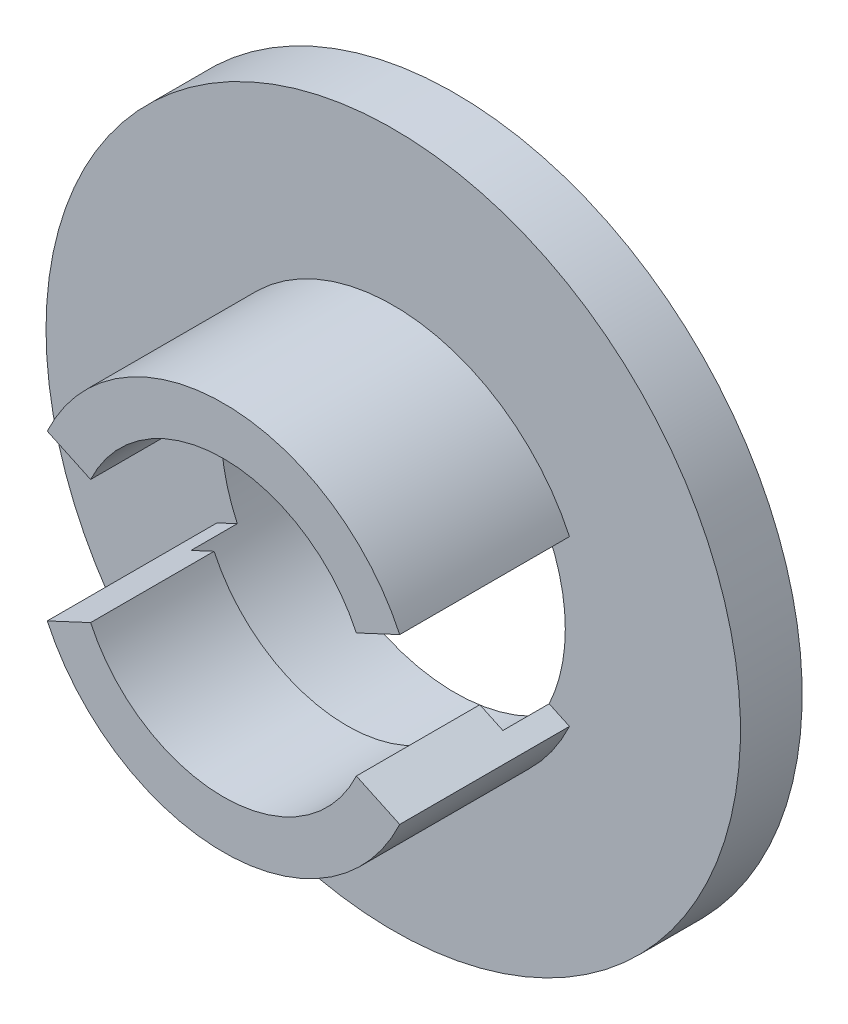
ISO-10303-21;
HEADER;
FILE_DESCRIPTION(('STEP AP214'),'2;1');
FILE_NAME('part.step','',(''),(''),'','','');
FILE_SCHEMA(('AUTOMOTIVE_DESIGN { 1 0 10303 214 1 1 1 1 }'));
ENDSEC;
DATA;
#1=APPLICATION_CONTEXT('core data for automotive mechanical design processes');
#2=APPLICATION_PROTOCOL_DEFINITION('international standard','automotive_design',2000,#1);
#3=PRODUCT_CONTEXT('',#1,'mechanical');
#4=PRODUCT('Part','Part','',(#3));
#5=PRODUCT_RELATED_PRODUCT_CATEGORY('part','',(#4));
#6=PRODUCT_DEFINITION_FORMATION('','',#4);
#7=PRODUCT_DEFINITION_CONTEXT('part definition',#1,'design');
#8=PRODUCT_DEFINITION('design','',#6,#7);
#9=PRODUCT_DEFINITION_SHAPE('','',#8);
#10=(LENGTH_UNIT() NAMED_UNIT(*) SI_UNIT(.MILLI.,.METRE.));
#11=(NAMED_UNIT(*) PLANE_ANGLE_UNIT() SI_UNIT($,.RADIAN.));
#12=(NAMED_UNIT(*) SI_UNIT($,.STERADIAN.) SOLID_ANGLE_UNIT());
#13=UNCERTAINTY_MEASURE_WITH_UNIT(LENGTH_MEASURE(1.E-05),#10,'distance_accuracy_value','');
#14=(GEOMETRIC_REPRESENTATION_CONTEXT(3) GLOBAL_UNCERTAINTY_ASSIGNED_CONTEXT((#13)) GLOBAL_UNIT_ASSIGNED_CONTEXT((#10,
#11,#12)) REPRESENTATION_CONTEXT('',''));
#15=CARTESIAN_POINT('',(0.,0.,0.));
#16=DIRECTION('',(0.,0.,1.));
#17=DIRECTION('',(1.,0.,0.));
#18=AXIS2_PLACEMENT_3D('',#15,#16,#17);
#19=CARTESIAN_POINT('',(-11.4194781166618,5.32499009793283,22.));
#20=DIRECTION('',(0.4226182617407,0.90630778703665,0.));
#21=DIRECTION('',(-0.90630778703665,0.4226182617407,0.));
#22=AXIS2_PLACEMENT_3D('',#19,#20,#21);
#23=PLANE('',#22);
#24=DIRECTION('',(0.906307787036649,-0.422618261740701,0.));
#25=VECTOR('',#24,1.);
#26=CARTESIAN_POINT('',(-11.4194781166618,5.32499009793283,11.));
#27=LINE('',#26,#25);
#28=CARTESIAN_POINT('',(-11.4194781166618,5.32499009793283,11.));
#29=VERTEX_POINT('',#28);
#30=CARTESIAN_POINT('',(-8.60992397684817,4.01487348653666,11.));
#31=VERTEX_POINT('',#30);
#32=EDGE_CURVE('E62',#29,#31,#27,.T.);
#33=ORIENTED_EDGE('',*,*,#32,.F.);
#34=DIRECTION('',(0.,0.,-1.));
#35=VECTOR('',#34,1.);
#36=CARTESIAN_POINT('',(-11.4194781166618,5.32499009793283,22.));
#37=LINE('',#36,#35);
#38=CARTESIAN_POINT('',(-11.4194781166618,5.32499009793283,0.));
#39=VERTEX_POINT('',#38);
#40=EDGE_CURVE('E171',#29,#39,#37,.T.);
#41=ORIENTED_EDGE('',*,*,#40,.T.);
#42=DIRECTION('',(0.906307787036649,-0.422618261740701,0.));
#43=VECTOR('',#42,1.);
#44=CARTESIAN_POINT('',(-11.4194781166618,5.32499009793283,0.));
#45=LINE('',#44,#43);
#46=CARTESIAN_POINT('',(-10.1053318254586,4.71219361840881,0.));
#47=VERTEX_POINT('',#46);
#48=EDGE_CURVE('E225',#39,#47,#45,.T.);
#49=ORIENTED_EDGE('',*,*,#48,.T.);
#50=DIRECTION('',(0.,0.,1.));
#51=VECTOR('',#50,1.);
#52=CARTESIAN_POINT('',(-10.1053318254586,4.71219361840881,-44.1636651713959));
#53=LINE('',#52,#51);
#54=CARTESIAN_POINT('',(-10.1053318254586,4.71219361840881,3.));
#55=VERTEX_POINT('',#54);
#56=EDGE_CURVE('E211',#55,#47,#53,.F.);
#57=ORIENTED_EDGE('',*,*,#56,.F.);
#58=DIRECTION('',(-0.906307787036649,0.422618261740701,0.));
#59=VECTOR('',#58,1.);
#60=CARTESIAN_POINT('',(0.,0.,3.));
#61=LINE('',#60,#59);
#62=CARTESIAN_POINT('',(-8.60992397684817,4.01487348653666,3.));
#63=VERTEX_POINT('',#62);
#64=EDGE_CURVE('E191',#63,#55,#61,.T.);
#65=ORIENTED_EDGE('',*,*,#64,.F.);
#66=DIRECTION('',(0.,0.,-1.));
#67=VECTOR('',#66,1.);
#68=CARTESIAN_POINT('',(-8.60992397684817,4.01487348653666,22.));
#69=LINE('',#68,#67);
#70=EDGE_CURVE('E173',#31,#63,#69,.T.);
#71=ORIENTED_EDGE('',*,*,#70,.F.);
#72=EDGE_LOOP('',(#33,#41,#49,#57,#65,#71));
#73=FACE_BOUND('',#72,.T.);
#74=ADVANCED_FACE('F47',(#73),#23,.F.);
#75=CARTESIAN_POINT('',(0.,0.,22.));
#76=DIRECTION('',(0.,0.,-1.));
#77=DIRECTION('',(-1.,0.,0.));
#78=AXIS2_PLACEMENT_3D('',#75,#76,#77);
#79=CYLINDRICAL_SURFACE('',#78,12.6);
#80=CARTESIAN_POINT('',(0.,0.,11.));
#81=DIRECTION('',(0.,0.,1.));
#82=DIRECTION('',(1.,0.,0.));
#83=AXIS2_PLACEMENT_3D('',#80,#81,#82);
#84=CIRCLE('',#83,12.6);
#85=CARTESIAN_POINT('',(11.4194781166618,5.32499009793283,11.));
#86=VERTEX_POINT('',#85);
#87=EDGE_CURVE('E233',#86,#29,#84,.T.);
#88=ORIENTED_EDGE('',*,*,#87,.F.);
#89=DIRECTION('',(0.,0.,-1.));
#90=VECTOR('',#89,1.);
#91=CARTESIAN_POINT('',(11.4194781166618,5.32499009793283,22.));
#92=LINE('',#91,#90);
#93=CARTESIAN_POINT('',(11.4194781166618,5.32499009793283,0.));
#94=VERTEX_POINT('',#93);
#95=EDGE_CURVE('E168',#86,#94,#92,.T.);
#96=ORIENTED_EDGE('',*,*,#95,.T.);
#97=CARTESIAN_POINT('',(0.,0.,0.));
#98=DIRECTION('',(0.,0.,-1.));
#99=DIRECTION('',(-1.,0.,0.));
#100=AXIS2_PLACEMENT_3D('',#97,#98,#99);
#101=CIRCLE('',#100,12.6);
#102=EDGE_CURVE('E240',#94,#39,#101,.F.);
#103=ORIENTED_EDGE('',*,*,#102,.T.);
#104=ORIENTED_EDGE('',*,*,#40,.F.);
#105=EDGE_LOOP('',(#88,#96,#103,#104));
#106=FACE_BOUND('',#105,.T.);
#107=ADVANCED_FACE('F269',(#106),#79,.T.);
#108=CARTESIAN_POINT('',(8.60992397684817,4.01487348653666,22.));
#109=DIRECTION('',(-0.422618261740701,0.906307787036649,0.));
#110=DIRECTION('',(-0.906307787036649,-0.422618261740701,0.));
#111=AXIS2_PLACEMENT_3D('',#108,#109,#110);
#112=PLANE('',#111);
#113=DIRECTION('',(0.906307787036649,0.422618261740701,0.));
#114=VECTOR('',#113,1.);
#115=CARTESIAN_POINT('',(8.60992397684817,4.01487348653666,11.));
#116=LINE('',#115,#114);
#117=CARTESIAN_POINT('',(8.60992397684817,4.01487348653666,11.));
#118=VERTEX_POINT('',#117);
#119=EDGE_CURVE('E235',#118,#86,#116,.T.);
#120=ORIENTED_EDGE('',*,*,#119,.F.);
#121=DIRECTION('',(0.,0.,-1.));
#122=VECTOR('',#121,1.);
#123=CARTESIAN_POINT('',(8.60992397684817,4.01487348653666,22.));
#124=LINE('',#123,#122);
#125=CARTESIAN_POINT('',(8.60992397684817,4.01487348653666,3.));
#126=VERTEX_POINT('',#125);
#127=EDGE_CURVE('E166',#118,#126,#124,.T.);
#128=ORIENTED_EDGE('',*,*,#127,.T.);
#129=DIRECTION('',(-0.906307787036649,-0.422618261740701,0.));
#130=VECTOR('',#129,1.);
#131=CARTESIAN_POINT('',(0.,0.,3.));
#132=LINE('',#131,#130);
#133=CARTESIAN_POINT('',(10.1053318254586,4.71219361840881,3.));
#134=VERTEX_POINT('',#133);
#135=EDGE_CURVE('E185',#134,#126,#132,.T.);
#136=ORIENTED_EDGE('',*,*,#135,.F.);
#137=DIRECTION('',(0.,0.,1.));
#138=VECTOR('',#137,1.);
#139=CARTESIAN_POINT('',(10.1053318254586,4.71219361840881,-44.1636651713959));
#140=LINE('',#139,#138);
#141=CARTESIAN_POINT('',(10.1053318254586,4.71219361840881,0.));
#142=VERTEX_POINT('',#141);
#143=EDGE_CURVE('E217',#142,#134,#140,.T.);
#144=ORIENTED_EDGE('',*,*,#143,.F.);
#145=DIRECTION('',(0.906307787036649,0.422618261740701,0.));
#146=VECTOR('',#145,1.);
#147=CARTESIAN_POINT('',(8.60992397684817,4.01487348653666,0.));
#148=LINE('',#147,#146);
#149=EDGE_CURVE('E228',#142,#94,#148,.T.);
#150=ORIENTED_EDGE('',*,*,#149,.T.);
#151=ORIENTED_EDGE('',*,*,#95,.F.);
#152=EDGE_LOOP('',(#120,#128,#136,#144,#150,#151));
#153=FACE_BOUND('',#152,.T.);
#154=ADVANCED_FACE('F265',(#153),#112,.F.);
#155=CARTESIAN_POINT('',(0.,0.,22.));
#156=DIRECTION('',(0.,0.,-1.));
#157=DIRECTION('',(-1.,0.,0.));
#158=AXIS2_PLACEMENT_3D('',#155,#156,#157);
#159=CYLINDRICAL_SURFACE('',#158,9.5);
#160=CARTESIAN_POINT('',(0.,0.,11.));
#161=DIRECTION('',(0.,0.,-1.));
#162=DIRECTION('',(1.,0.,0.));
#163=AXIS2_PLACEMENT_3D('',#160,#161,#162);
#164=CIRCLE('',#163,9.5);
#165=EDGE_CURVE('E141',#31,#118,#164,.T.);
#166=ORIENTED_EDGE('',*,*,#165,.F.);
#167=ORIENTED_EDGE('',*,*,#70,.T.);
#168=CARTESIAN_POINT('',(0.,0.,3.));
#169=DIRECTION('',(0.,0.,-1.));
#170=DIRECTION('',(-1.,0.,0.));
#171=AXIS2_PLACEMENT_3D('',#168,#169,#170);
#172=CIRCLE('',#171,9.5);
#173=EDGE_CURVE('E188',#126,#63,#172,.F.);
#174=ORIENTED_EDGE('',*,*,#173,.F.);
#175=ORIENTED_EDGE('',*,*,#127,.F.);
#176=EDGE_LOOP('',(#166,#167,#174,#175));
#177=FACE_BOUND('',#176,.T.);
#178=ADVANCED_FACE('F273',(#177),#159,.F.);
#179=CARTESIAN_POINT('',(-11.4194781166618,-5.32499009793283,22.));
#180=DIRECTION('',(0.422618261740701,-0.906307787036649,0.));
#181=DIRECTION('',(0.906307787036649,0.422618261740701,0.));
#182=AXIS2_PLACEMENT_3D('',#179,#180,#181);
#183=PLANE('',#182);
#184=DIRECTION('',(-0.906307787036649,-0.422618261740702,0.));
#185=VECTOR('',#184,1.);
#186=CARTESIAN_POINT('',(-8.60992397684817,-4.01487348653666,11.));
#187=LINE('',#186,#185);
#188=CARTESIAN_POINT('',(-8.60992397684817,-4.01487348653666,11.));
#189=VERTEX_POINT('',#188);
#190=CARTESIAN_POINT('',(-11.4194781166618,-5.32499009793283,11.));
#191=VERTEX_POINT('',#190);
#192=EDGE_CURVE('E70',#189,#191,#187,.T.);
#193=ORIENTED_EDGE('',*,*,#192,.F.);
#194=DIRECTION('',(0.,0.,-1.));
#195=VECTOR('',#194,1.);
#196=CARTESIAN_POINT('',(-8.60992397684817,-4.01487348653666,22.));
#197=LINE('',#196,#195);
#198=CARTESIAN_POINT('',(-8.60992397684817,-4.01487348653666,3.));
#199=VERTEX_POINT('',#198);
#200=EDGE_CURVE('E162',#189,#199,#197,.T.);
#201=ORIENTED_EDGE('',*,*,#200,.T.);
#202=DIRECTION('',(0.906307787036649,0.422618261740702,0.));
#203=VECTOR('',#202,1.);
#204=CARTESIAN_POINT('',(0.,0.,3.));
#205=LINE('',#204,#203);
#206=CARTESIAN_POINT('',(-10.1053318254586,-4.71219361840881,3.));
#207=VERTEX_POINT('',#206);
#208=EDGE_CURVE('E11',#207,#199,#205,.T.);
#209=ORIENTED_EDGE('',*,*,#208,.F.);
#210=DIRECTION('',(0.,0.,1.));
#211=VECTOR('',#210,1.);
#212=CARTESIAN_POINT('',(-10.1053318254586,-4.71219361840881,-44.1636651713959));
#213=LINE('',#212,#211);
#214=CARTESIAN_POINT('',(-10.1053318254586,-4.71219361840881,0.));
#215=VERTEX_POINT('',#214);
#216=EDGE_CURVE('E210',#215,#207,#213,.T.);
#217=ORIENTED_EDGE('',*,*,#216,.F.);
#218=DIRECTION('',(-0.906307787036649,-0.422618261740702,0.));
#219=VECTOR('',#218,1.);
#220=CARTESIAN_POINT('',(-8.60992397684817,-4.01487348653666,0.));
#221=LINE('',#220,#219);
#222=CARTESIAN_POINT('',(-11.4194781166618,-5.32499009793283,0.));
#223=VERTEX_POINT('',#222);
#224=EDGE_CURVE('E239',#215,#223,#221,.T.);
#225=ORIENTED_EDGE('',*,*,#224,.T.);
#226=DIRECTION('',(0.,0.,-1.));
#227=VECTOR('',#226,1.);
#228=CARTESIAN_POINT('',(-11.4194781166618,-5.32499009793283,22.));
#229=LINE('',#228,#227);
#230=EDGE_CURVE('E174',#191,#223,#229,.T.);
#231=ORIENTED_EDGE('',*,*,#230,.F.);
#232=EDGE_LOOP('',(#193,#201,#209,#217,#225,#231));
#233=FACE_BOUND('',#232,.T.);
#234=ADVANCED_FACE('F223',(#233),#183,.F.);
#235=CARTESIAN_POINT('',(0.,0.,22.));
#236=DIRECTION('',(0.,0.,-1.));
#237=DIRECTION('',(-1.,0.,0.));
#238=AXIS2_PLACEMENT_3D('',#235,#236,#237);
#239=CYLINDRICAL_SURFACE('',#238,9.5);
#240=CARTESIAN_POINT('',(0.,0.,11.));
#241=DIRECTION('',(0.,0.,-1.));
#242=DIRECTION('',(1.,0.,0.));
#243=AXIS2_PLACEMENT_3D('',#240,#241,#242);
#244=CIRCLE('',#243,9.5);
#245=CARTESIAN_POINT('',(8.60992397684817,-4.01487348653666,11.));
#246=VERTEX_POINT('',#245);
#247=EDGE_CURVE('E151',#246,#189,#244,.T.);
#248=ORIENTED_EDGE('',*,*,#247,.F.);
#249=DIRECTION('',(0.,0.,-1.));
#250=VECTOR('',#249,1.);
#251=CARTESIAN_POINT('',(8.60992397684817,-4.01487348653666,22.));
#252=LINE('',#251,#250);
#253=CARTESIAN_POINT('',(8.60992397684817,-4.01487348653666,3.));
#254=VERTEX_POINT('',#253);
#255=EDGE_CURVE('E150',#246,#254,#252,.T.);
#256=ORIENTED_EDGE('',*,*,#255,.T.);
#257=CARTESIAN_POINT('',(0.,0.,3.));
#258=DIRECTION('',(0.,0.,-1.));
#259=DIRECTION('',(-1.,0.,0.));
#260=AXIS2_PLACEMENT_3D('',#257,#258,#259);
#261=CIRCLE('',#260,9.5);
#262=EDGE_CURVE('E55',#199,#254,#261,.F.);
#263=ORIENTED_EDGE('',*,*,#262,.F.);
#264=ORIENTED_EDGE('',*,*,#200,.F.);
#265=EDGE_LOOP('',(#248,#256,#263,#264));
#266=FACE_BOUND('',#265,.T.);
#267=ADVANCED_FACE('F204',(#266),#239,.F.);
#268=CARTESIAN_POINT('',(8.60992397684817,-4.01487348653666,22.));
#269=DIRECTION('',(-0.422618261740701,-0.906307787036649,0.));
#270=DIRECTION('',(0.906307787036649,-0.422618261740701,0.));
#271=AXIS2_PLACEMENT_3D('',#268,#269,#270);
#272=PLANE('',#271);
#273=DIRECTION('',(-0.906307787036649,0.422618261740701,0.));
#274=VECTOR('',#273,1.);
#275=CARTESIAN_POINT('',(11.4194781166618,-5.32499009793283,11.));
#276=LINE('',#275,#274);
#277=CARTESIAN_POINT('',(11.4194781166618,-5.32499009793283,11.));
#278=VERTEX_POINT('',#277);
#279=EDGE_CURVE('E136',#278,#246,#276,.T.);
#280=ORIENTED_EDGE('',*,*,#279,.F.);
#281=DIRECTION('',(0.,0.,-1.));
#282=VECTOR('',#281,1.);
#283=CARTESIAN_POINT('',(11.4194781166618,-5.32499009793283,22.));
#284=LINE('',#283,#282);
#285=CARTESIAN_POINT('',(11.4194781166618,-5.32499009793283,0.));
#286=VERTEX_POINT('',#285);
#287=EDGE_CURVE('E147',#278,#286,#284,.T.);
#288=ORIENTED_EDGE('',*,*,#287,.T.);
#289=DIRECTION('',(-0.906307787036649,0.422618261740701,0.));
#290=VECTOR('',#289,1.);
#291=CARTESIAN_POINT('',(11.4194781166618,-5.32499009793283,0.));
#292=LINE('',#291,#290);
#293=CARTESIAN_POINT('',(10.1053318254586,-4.71219361840881,0.));
#294=VERTEX_POINT('',#293);
#295=EDGE_CURVE('E207',#286,#294,#292,.T.);
#296=ORIENTED_EDGE('',*,*,#295,.T.);
#297=DIRECTION('',(0.,0.,1.));
#298=VECTOR('',#297,1.);
#299=CARTESIAN_POINT('',(10.1053318254586,-4.71219361840881,-44.1636651713959));
#300=LINE('',#299,#298);
#301=CARTESIAN_POINT('',(10.1053318254586,-4.71219361840881,3.));
#302=VERTEX_POINT('',#301);
#303=EDGE_CURVE('E206',#302,#294,#300,.F.);
#304=ORIENTED_EDGE('',*,*,#303,.F.);
#305=DIRECTION('',(0.906307787036649,-0.422618261740701,0.));
#306=VECTOR('',#305,1.);
#307=CARTESIAN_POINT('',(0.,0.,3.));
#308=LINE('',#307,#306);
#309=EDGE_CURVE('E194',#254,#302,#308,.T.);
#310=ORIENTED_EDGE('',*,*,#309,.F.);
#311=ORIENTED_EDGE('',*,*,#255,.F.);
#312=EDGE_LOOP('',(#280,#288,#296,#304,#310,#311));
#313=FACE_BOUND('',#312,.T.);
#314=ADVANCED_FACE('F145',(#313),#272,.F.);
#315=CARTESIAN_POINT('',(0.,0.,22.));
#316=DIRECTION('',(0.,0.,-1.));
#317=DIRECTION('',(-1.,0.,0.));
#318=AXIS2_PLACEMENT_3D('',#315,#316,#317);
#319=CYLINDRICAL_SURFACE('',#318,12.6);
#320=CARTESIAN_POINT('',(0.,0.,11.));
#321=DIRECTION('',(0.,0.,1.));
#322=DIRECTION('',(1.,0.,0.));
#323=AXIS2_PLACEMENT_3D('',#320,#321,#322);
#324=CIRCLE('',#323,12.6);
#325=EDGE_CURVE('E133',#191,#278,#324,.T.);
#326=ORIENTED_EDGE('',*,*,#325,.F.);
#327=ORIENTED_EDGE('',*,*,#230,.T.);
#328=CARTESIAN_POINT('',(0.,0.,0.));
#329=DIRECTION('',(0.,0.,-1.));
#330=DIRECTION('',(-1.,0.,0.));
#331=AXIS2_PLACEMENT_3D('',#328,#329,#330);
#332=CIRCLE('',#331,12.6);
#333=EDGE_CURVE('E156',#223,#286,#332,.F.);
#334=ORIENTED_EDGE('',*,*,#333,.T.);
#335=ORIENTED_EDGE('',*,*,#287,.F.);
#336=EDGE_LOOP('',(#326,#327,#334,#335));
#337=FACE_BOUND('',#336,.T.);
#338=ADVANCED_FACE('F154',(#337),#319,.T.);
#339=CARTESIAN_POINT('',(0.,0.,-44.1636651713959));
#340=DIRECTION('',(0.,0.,1.));
#341=DIRECTION('',(1.,0.,0.));
#342=AXIS2_PLACEMENT_3D('',#339,#340,#341);
#343=CYLINDRICAL_SURFACE('',#342,11.15);
#344=CARTESIAN_POINT('',(0.,0.,-4.));
#345=DIRECTION('',(0.,0.,-1.));
#346=DIRECTION('',(-1.,0.,0.));
#347=AXIS2_PLACEMENT_3D('',#344,#345,#346);
#348=CIRCLE('',#347,11.15);
#349=CARTESIAN_POINT('',(-11.15,0.,-4.));
#350=VERTEX_POINT('',#349);
#351=EDGE_CURVE('E157',#350,#350,#348,.T.);
#352=ORIENTED_EDGE('',*,*,#351,.T.);
#353=EDGE_LOOP('',(#352));
#354=FACE_BOUND('',#353,.T.);
#355=CARTESIAN_POINT('',(0.,0.,3.));
#356=DIRECTION('',(0.,0.,-1.));
#357=DIRECTION('',(-1.,0.,0.));
#358=AXIS2_PLACEMENT_3D('',#355,#356,#357);
#359=CIRCLE('',#358,11.15);
#360=EDGE_CURVE('E179',#302,#207,#359,.T.);
#361=ORIENTED_EDGE('',*,*,#360,.F.);
#362=ORIENTED_EDGE('',*,*,#303,.T.);
#363=CARTESIAN_POINT('',(0.,0.,0.));
#364=DIRECTION('',(0.,0.,-1.));
#365=DIRECTION('',(-1.,0.,0.));
#366=AXIS2_PLACEMENT_3D('',#363,#364,#365);
#367=CIRCLE('',#366,11.15);
#368=EDGE_CURVE('E169',#142,#294,#367,.T.);
#369=ORIENTED_EDGE('',*,*,#368,.F.);
#370=ORIENTED_EDGE('',*,*,#143,.T.);
#371=EDGE_CURVE('E182',#55,#134,#359,.T.);
#372=ORIENTED_EDGE('',*,*,#371,.F.);
#373=ORIENTED_EDGE('',*,*,#56,.T.);
#374=EDGE_CURVE('E214',#215,#47,#367,.T.);
#375=ORIENTED_EDGE('',*,*,#374,.F.);
#376=ORIENTED_EDGE('',*,*,#216,.T.);
#377=EDGE_LOOP('',(#361,#362,#369,#370,#372,#373,#375,#376));
#378=FACE_BOUND('',#377,.T.);
#379=ADVANCED_FACE('F248',(#354,#378),#343,.F.);
#380=CARTESIAN_POINT('',(0.,0.,3.));
#381=DIRECTION('',(0.,0.,-1.));
#382=DIRECTION('',(-1.,0.,0.));
#383=AXIS2_PLACEMENT_3D('',#380,#381,#382);
#384=PLANE('',#383);
#385=ORIENTED_EDGE('',*,*,#360,.T.);
#386=ORIENTED_EDGE('',*,*,#208,.T.);
#387=ORIENTED_EDGE('',*,*,#262,.T.);
#388=ORIENTED_EDGE('',*,*,#309,.T.);
#389=EDGE_LOOP('',(#385,#386,#387,#388));
#390=FACE_BOUND('',#389,.T.);
#391=ADVANCED_FACE('F200',(#390),#384,.T.);
#392=ORIENTED_EDGE('',*,*,#173,.T.);
#393=ORIENTED_EDGE('',*,*,#64,.T.);
#394=ORIENTED_EDGE('',*,*,#371,.T.);
#395=ORIENTED_EDGE('',*,*,#135,.T.);
#396=EDGE_LOOP('',(#392,#393,#394,#395));
#397=FACE_BOUND('',#396,.T.);
#398=ADVANCED_FACE('F252',(#397),#384,.T.);
#399=CARTESIAN_POINT('',(0.,0.,0.));
#400=DIRECTION('',(0.,0.,-1.));
#401=DIRECTION('',(-1.,0.,0.));
#402=AXIS2_PLACEMENT_3D('',#399,#400,#401);
#403=PLANE('',#402);
#404=CARTESIAN_POINT('',(0.,0.,0.));
#405=DIRECTION('',(0.,0.,-1.));
#406=DIRECTION('',(-1.,0.,0.));
#407=AXIS2_PLACEMENT_3D('',#404,#405,#406);
#408=CIRCLE('',#407,22.5);
#409=CARTESIAN_POINT('',(-22.5,0.,0.));
#410=VERTEX_POINT('',#409);
#411=EDGE_CURVE('E160',#410,#410,#408,.T.);
#412=ORIENTED_EDGE('',*,*,#411,.F.);
#413=EDGE_LOOP('',(#412));
#414=FACE_BOUND('',#413,.T.);
#415=ORIENTED_EDGE('',*,*,#368,.T.);
#416=ORIENTED_EDGE('',*,*,#295,.F.);
#417=ORIENTED_EDGE('',*,*,#333,.F.);
#418=ORIENTED_EDGE('',*,*,#224,.F.);
#419=ORIENTED_EDGE('',*,*,#374,.T.);
#420=ORIENTED_EDGE('',*,*,#48,.F.);
#421=ORIENTED_EDGE('',*,*,#102,.F.);
#422=ORIENTED_EDGE('',*,*,#149,.F.);
#423=EDGE_LOOP('',(#415,#416,#417,#418,#419,#420,#421,#422));
#424=FACE_BOUND('',#423,.T.);
#425=ADVANCED_FACE('F261',(#414,#424),#403,.F.);
#426=CARTESIAN_POINT('',(0.,0.,-4.));
#427=DIRECTION('',(0.,0.,1.));
#428=DIRECTION('',(1.,0.,0.));
#429=AXIS2_PLACEMENT_3D('',#426,#427,#428);
#430=CYLINDRICAL_SURFACE('',#429,22.5);
#431=CARTESIAN_POINT('',(0.,0.,-4.));
#432=DIRECTION('',(0.,0.,-1.));
#433=DIRECTION('',(-1.,0.,0.));
#434=AXIS2_PLACEMENT_3D('',#431,#432,#433);
#435=CIRCLE('',#434,22.5);
#436=CARTESIAN_POINT('',(-22.5,0.,-4.));
#437=VERTEX_POINT('',#436);
#438=EDGE_CURVE('E176',#437,#437,#435,.T.);
#439=ORIENTED_EDGE('',*,*,#438,.F.);
#440=EDGE_LOOP('',(#439));
#441=FACE_BOUND('',#440,.T.);
#442=ORIENTED_EDGE('',*,*,#411,.T.);
#443=EDGE_LOOP('',(#442));
#444=FACE_BOUND('',#443,.T.);
#445=ADVANCED_FACE('F49',(#441,#444),#430,.T.);
#446=CARTESIAN_POINT('',(0.,0.,-4.));
#447=DIRECTION('',(0.,0.,-1.));
#448=DIRECTION('',(-1.,0.,0.));
#449=AXIS2_PLACEMENT_3D('',#446,#447,#448);
#450=PLANE('',#449);
#451=ORIENTED_EDGE('',*,*,#438,.T.);
#452=EDGE_LOOP('',(#451));
#453=FACE_BOUND('',#452,.T.);
#454=ORIENTED_EDGE('',*,*,#351,.F.);
#455=EDGE_LOOP('',(#454));
#456=FACE_BOUND('',#455,.T.);
#457=ADVANCED_FACE('F296',(#453,#456),#450,.T.);
#458=CARTESIAN_POINT('',(0.,0.,11.));
#459=DIRECTION('',(0.,0.,1.));
#460=DIRECTION('',(1.,0.,0.));
#461=AXIS2_PLACEMENT_3D('',#458,#459,#460);
#462=PLANE('',#461);
#463=ORIENTED_EDGE('',*,*,#325,.T.);
#464=ORIENTED_EDGE('',*,*,#279,.T.);
#465=ORIENTED_EDGE('',*,*,#247,.T.);
#466=ORIENTED_EDGE('',*,*,#192,.T.);
#467=EDGE_LOOP('',(#463,#464,#465,#466));
#468=FACE_BOUND('',#467,.T.);
#469=ADVANCED_FACE('F135',(#468),#462,.T.);
#470=CARTESIAN_POINT('',(0.,0.,11.));
#471=DIRECTION('',(0.,0.,1.));
#472=DIRECTION('',(1.,0.,0.));
#473=AXIS2_PLACEMENT_3D('',#470,#471,#472);
#474=PLANE('',#473);
#475=ORIENTED_EDGE('',*,*,#165,.T.);
#476=ORIENTED_EDGE('',*,*,#119,.T.);
#477=ORIENTED_EDGE('',*,*,#87,.T.);
#478=ORIENTED_EDGE('',*,*,#32,.T.);
#479=EDGE_LOOP('',(#475,#476,#477,#478));
#480=FACE_BOUND('',#479,.T.);
#481=ADVANCED_FACE('F271',(#480),#474,.T.);
#482=CLOSED_SHELL('',(#74,#107,#154,#178,#234,#267,#314,#338,#379,#391,#398,#425,#445,#457,#469,#481));
#483=MANIFOLD_SOLID_BREP('B2',#482);
#484=ADVANCED_BREP_SHAPE_REPRESENTATION('',(#18,#483),#14);
#485=SHAPE_DEFINITION_REPRESENTATION(#9,#484);
ENDSEC;
END-ISO-10303-21;
